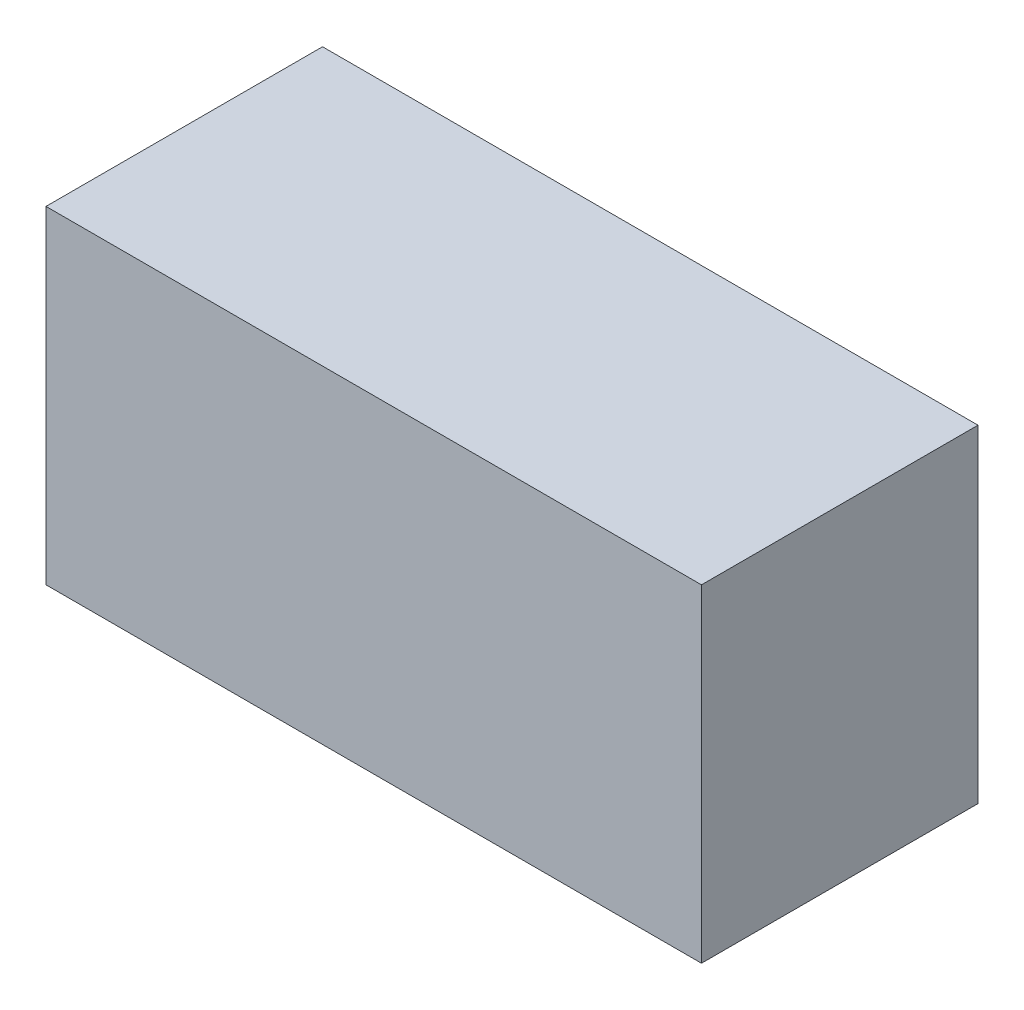
ISO-10303-21;
HEADER;
FILE_DESCRIPTION(('STEP AP214'),'2;1');
FILE_NAME('part.step','',(''),(''),'','','');
FILE_SCHEMA(('AUTOMOTIVE_DESIGN { 1 0 10303 214 1 1 1 1 }'));
ENDSEC;
DATA;
#1=APPLICATION_CONTEXT('core data for automotive mechanical design processes');
#2=APPLICATION_PROTOCOL_DEFINITION('international standard','automotive_design',2000,#1);
#3=PRODUCT_CONTEXT('',#1,'mechanical');
#4=PRODUCT('Part','Part','',(#3));
#5=PRODUCT_RELATED_PRODUCT_CATEGORY('part','',(#4));
#6=PRODUCT_DEFINITION_FORMATION('','',#4);
#7=PRODUCT_DEFINITION_CONTEXT('part definition',#1,'design');
#8=PRODUCT_DEFINITION('design','',#6,#7);
#9=PRODUCT_DEFINITION_SHAPE('','',#8);
#10=(LENGTH_UNIT() NAMED_UNIT(*) SI_UNIT(.MILLI.,.METRE.));
#11=(NAMED_UNIT(*) PLANE_ANGLE_UNIT() SI_UNIT($,.RADIAN.));
#12=(NAMED_UNIT(*) SI_UNIT($,.STERADIAN.) SOLID_ANGLE_UNIT());
#13=UNCERTAINTY_MEASURE_WITH_UNIT(LENGTH_MEASURE(1.E-05),#10,'distance_accuracy_value','');
#14=(GEOMETRIC_REPRESENTATION_CONTEXT(3) GLOBAL_UNCERTAINTY_ASSIGNED_CONTEXT((#13)) GLOBAL_UNIT_ASSIGNED_CONTEXT((#10,
#11,#12)) REPRESENTATION_CONTEXT('',''));
#15=CARTESIAN_POINT('',(0.,0.,0.));
#16=DIRECTION('',(0.,0.,1.));
#17=DIRECTION('',(1.,0.,0.));
#18=AXIS2_PLACEMENT_3D('',#15,#16,#17);
#19=CARTESIAN_POINT('',(1.5999968,0.80000094,1.34999984));
#20=DIRECTION('',(0.,0.,-1.));
#21=DIRECTION('',(-1.,0.,0.));
#22=AXIS2_PLACEMENT_3D('',#19,#20,#21);
#23=PLANE('',#22);
#24=DIRECTION('',(0.,1.,0.));
#25=VECTOR('',#24,1.);
#26=CARTESIAN_POINT('',(-1.5999968,0.80000094,1.34999984));
#27=LINE('',#26,#25);
#28=CARTESIAN_POINT('',(-1.5999968,0.80000094,1.34999984));
#29=VERTEX_POINT('',#28);
#30=CARTESIAN_POINT('',(-1.5999968,-0.80000094,1.34999984));
#31=VERTEX_POINT('',#30);
#32=EDGE_CURVE('E54',#29,#31,#27,.F.);
#33=ORIENTED_EDGE('',*,*,#32,.T.);
#34=DIRECTION('',(1.,0.,0.));
#35=VECTOR('',#34,1.);
#36=CARTESIAN_POINT('',(-1.5999968,-0.80000094,1.34999984));
#37=LINE('',#36,#35);
#38=CARTESIAN_POINT('',(1.5999968,-0.80000094,1.34999984));
#39=VERTEX_POINT('',#38);
#40=EDGE_CURVE('E56',#31,#39,#37,.T.);
#41=ORIENTED_EDGE('',*,*,#40,.T.);
#42=DIRECTION('',(0.,1.,0.));
#43=VECTOR('',#42,1.);
#44=CARTESIAN_POINT('',(1.5999968,-0.80000094,1.34999984));
#45=LINE('',#44,#43);
#46=CARTESIAN_POINT('',(1.5999968,0.80000094,1.34999984));
#47=VERTEX_POINT('',#46);
#48=EDGE_CURVE('E19',#39,#47,#45,.T.);
#49=ORIENTED_EDGE('',*,*,#48,.T.);
#50=DIRECTION('',(1.,0.,0.));
#51=VECTOR('',#50,1.);
#52=CARTESIAN_POINT('',(1.5999968,0.80000094,1.34999984));
#53=LINE('',#52,#51);
#54=EDGE_CURVE('E79',#47,#29,#53,.F.);
#55=ORIENTED_EDGE('',*,*,#54,.T.);
#56=EDGE_LOOP('',(#33,#41,#49,#55));
#57=FACE_BOUND('',#56,.T.);
#58=ADVANCED_FACE('F16',(#57),#23,.F.);
#59=CARTESIAN_POINT('',(1.5999968,-0.80000094,0.));
#60=DIRECTION('',(-1.,0.,0.));
#61=DIRECTION('',(0.,0.,1.));
#62=AXIS2_PLACEMENT_3D('',#59,#60,#61);
#63=PLANE('',#62);
#64=DIRECTION('',(0.,0.,-1.));
#65=VECTOR('',#64,1.);
#66=CARTESIAN_POINT('',(1.5999968,0.80000094,0.));
#67=LINE('',#66,#65);
#68=CARTESIAN_POINT('',(1.5999968,0.80000094,0.));
#69=VERTEX_POINT('',#68);
#70=EDGE_CURVE('E67',#69,#47,#67,.F.);
#71=ORIENTED_EDGE('',*,*,#70,.T.);
#72=ORIENTED_EDGE('',*,*,#48,.F.);
#73=DIRECTION('',(0.,0.,1.));
#74=VECTOR('',#73,1.);
#75=CARTESIAN_POINT('',(1.5999968,-0.80000094,0.));
#76=LINE('',#75,#74);
#77=CARTESIAN_POINT('',(1.5999968,-0.80000094,0.));
#78=VERTEX_POINT('',#77);
#79=EDGE_CURVE('E62',#39,#78,#76,.F.);
#80=ORIENTED_EDGE('',*,*,#79,.T.);
#81=DIRECTION('',(0.,1.,0.));
#82=VECTOR('',#81,1.);
#83=CARTESIAN_POINT('',(1.5999968,0.80000094,0.));
#84=LINE('',#83,#82);
#85=EDGE_CURVE('E82',#69,#78,#84,.F.);
#86=ORIENTED_EDGE('',*,*,#85,.F.);
#87=EDGE_LOOP('',(#71,#72,#80,#86));
#88=FACE_BOUND('',#87,.T.);
#89=ADVANCED_FACE('F64',(#88),#63,.F.);
#90=CARTESIAN_POINT('',(-1.5999968,-0.80000094,0.));
#91=DIRECTION('',(0.,1.,0.));
#92=DIRECTION('',(0.,0.,1.));
#93=AXIS2_PLACEMENT_3D('',#90,#91,#92);
#94=PLANE('',#93);
#95=ORIENTED_EDGE('',*,*,#79,.F.);
#96=ORIENTED_EDGE('',*,*,#40,.F.);
#97=DIRECTION('',(0.,0.,-1.));
#98=VECTOR('',#97,1.);
#99=CARTESIAN_POINT('',(-1.5999968,-0.80000094,0.));
#100=LINE('',#99,#98);
#101=CARTESIAN_POINT('',(-1.5999968,-0.80000094,0.));
#102=VERTEX_POINT('',#101);
#103=EDGE_CURVE('E74',#31,#102,#100,.T.);
#104=ORIENTED_EDGE('',*,*,#103,.T.);
#105=DIRECTION('',(-1.,0.,0.));
#106=VECTOR('',#105,1.);
#107=CARTESIAN_POINT('',(1.5999968,-0.80000094,0.));
#108=LINE('',#107,#106);
#109=EDGE_CURVE('E71',#78,#102,#108,.T.);
#110=ORIENTED_EDGE('',*,*,#109,.F.);
#111=EDGE_LOOP('',(#95,#96,#104,#110));
#112=FACE_BOUND('',#111,.T.);
#113=ADVANCED_FACE('F69',(#112),#94,.F.);
#114=CARTESIAN_POINT('',(-1.5999968,0.80000094,0.));
#115=DIRECTION('',(1.,0.,0.));
#116=DIRECTION('',(0.,0.,-1.));
#117=AXIS2_PLACEMENT_3D('',#114,#115,#116);
#118=PLANE('',#117);
#119=ORIENTED_EDGE('',*,*,#103,.F.);
#120=ORIENTED_EDGE('',*,*,#32,.F.);
#121=DIRECTION('',(0.,0.,-1.));
#122=VECTOR('',#121,1.);
#123=CARTESIAN_POINT('',(-1.5999968,0.80000094,0.));
#124=LINE('',#123,#122);
#125=CARTESIAN_POINT('',(-1.5999968,0.80000094,0.));
#126=VERTEX_POINT('',#125);
#127=EDGE_CURVE('E34',#29,#126,#124,.T.);
#128=ORIENTED_EDGE('',*,*,#127,.T.);
#129=DIRECTION('',(0.,1.,0.));
#130=VECTOR('',#129,1.);
#131=CARTESIAN_POINT('',(-1.5999968,0.80000094,0.));
#132=LINE('',#131,#130);
#133=EDGE_CURVE('E25',#102,#126,#132,.T.);
#134=ORIENTED_EDGE('',*,*,#133,.F.);
#135=EDGE_LOOP('',(#119,#120,#128,#134));
#136=FACE_BOUND('',#135,.T.);
#137=ADVANCED_FACE('F88',(#136),#118,.F.);
#138=CARTESIAN_POINT('',(1.5999968,0.80000094,0.));
#139=DIRECTION('',(0.,-1.,0.));
#140=DIRECTION('',(0.,0.,-1.));
#141=AXIS2_PLACEMENT_3D('',#138,#139,#140);
#142=PLANE('',#141);
#143=ORIENTED_EDGE('',*,*,#127,.F.);
#144=ORIENTED_EDGE('',*,*,#54,.F.);
#145=ORIENTED_EDGE('',*,*,#70,.F.);
#146=DIRECTION('',(-1.,0.,0.));
#147=VECTOR('',#146,1.);
#148=CARTESIAN_POINT('',(1.5999968,0.80000094,0.));
#149=LINE('',#148,#147);
#150=EDGE_CURVE('E11',#126,#69,#149,.F.);
#151=ORIENTED_EDGE('',*,*,#150,.F.);
#152=EDGE_LOOP('',(#143,#144,#145,#151));
#153=FACE_BOUND('',#152,.T.);
#154=ADVANCED_FACE('F90',(#153),#142,.F.);
#155=CARTESIAN_POINT('',(1.5999968,0.80000094,0.));
#156=DIRECTION('',(0.,0.,-1.));
#157=DIRECTION('',(-1.,0.,0.));
#158=AXIS2_PLACEMENT_3D('',#155,#156,#157);
#159=PLANE('',#158);
#160=ORIENTED_EDGE('',*,*,#133,.T.);
#161=ORIENTED_EDGE('',*,*,#150,.T.);
#162=ORIENTED_EDGE('',*,*,#85,.T.);
#163=ORIENTED_EDGE('',*,*,#109,.T.);
#164=EDGE_LOOP('',(#160,#161,#162,#163));
#165=FACE_BOUND('',#164,.T.);
#166=ADVANCED_FACE('F87',(#165),#159,.T.);
#167=CLOSED_SHELL('',(#58,#89,#113,#137,#154,#166));
#168=MANIFOLD_SOLID_BREP('B1',#167);
#169=ADVANCED_BREP_SHAPE_REPRESENTATION('',(#18,#168),#14);
#170=SHAPE_DEFINITION_REPRESENTATION(#9,#169);
ENDSEC;
END-ISO-10303-21;
